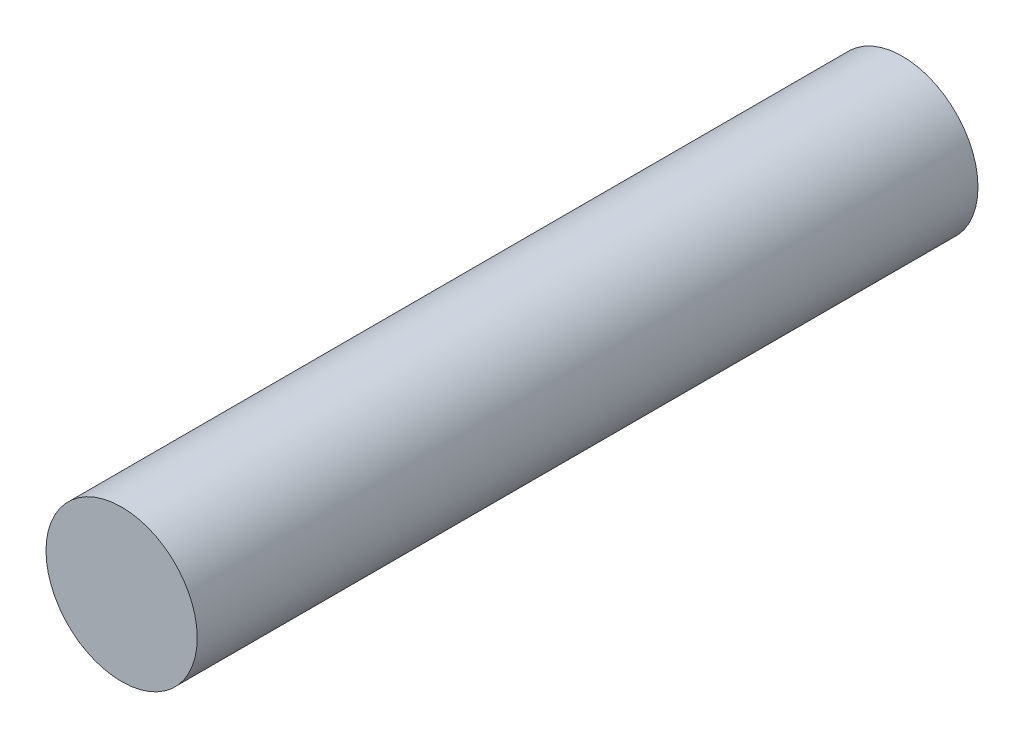
ISO-10303-21;
HEADER;
FILE_DESCRIPTION(('STEP AP214'),'2;1');
FILE_NAME('part.step','',(''),(''),'','','');
FILE_SCHEMA(('AUTOMOTIVE_DESIGN { 1 0 10303 214 1 1 1 1 }'));
ENDSEC;
DATA;
#1=APPLICATION_CONTEXT('core data for automotive mechanical design processes');
#2=APPLICATION_PROTOCOL_DEFINITION('international standard','automotive_design',2000,#1);
#3=PRODUCT_CONTEXT('',#1,'mechanical');
#4=PRODUCT('Part','Part','',(#3));
#5=PRODUCT_RELATED_PRODUCT_CATEGORY('part','',(#4));
#6=PRODUCT_DEFINITION_FORMATION('','',#4);
#7=PRODUCT_DEFINITION_CONTEXT('part definition',#1,'design');
#8=PRODUCT_DEFINITION('design','',#6,#7);
#9=PRODUCT_DEFINITION_SHAPE('','',#8);
#10=(LENGTH_UNIT() NAMED_UNIT(*) SI_UNIT(.MILLI.,.METRE.));
#11=(NAMED_UNIT(*) PLANE_ANGLE_UNIT() SI_UNIT($,.RADIAN.));
#12=(NAMED_UNIT(*) SI_UNIT($,.STERADIAN.) SOLID_ANGLE_UNIT());
#13=UNCERTAINTY_MEASURE_WITH_UNIT(LENGTH_MEASURE(1.E-05),#10,'distance_accuracy_value','');
#14=(GEOMETRIC_REPRESENTATION_CONTEXT(3) GLOBAL_UNCERTAINTY_ASSIGNED_CONTEXT((#13)) GLOBAL_UNIT_ASSIGNED_CONTEXT((#10,
#11,#12)) REPRESENTATION_CONTEXT('',''));
#15=CARTESIAN_POINT('',(0.,0.,0.));
#16=DIRECTION('',(0.,0.,1.));
#17=DIRECTION('',(1.,0.,0.));
#18=AXIS2_PLACEMENT_3D('',#15,#16,#17);
#19=CARTESIAN_POINT('',(0.,0.,11.3577510003558));
#20=DIRECTION('',(0.,0.,1.));
#21=DIRECTION('',(1.,0.,0.));
#22=AXIS2_PLACEMENT_3D('',#19,#20,#21);
#23=PLANE('',#22);
#24=CARTESIAN_POINT('',(0.,0.,11.3577510003558));
#25=DIRECTION('',(0.,0.,-1.));
#26=DIRECTION('',(-1.,0.,0.));
#27=AXIS2_PLACEMENT_3D('',#24,#25,#26);
#28=CIRCLE('',#27,2.2);
#29=CARTESIAN_POINT('',(-2.2,0.,11.3577510003558));
#30=VERTEX_POINT('',#29);
#31=EDGE_CURVE('E9',#30,#30,#28,.T.);
#32=ORIENTED_EDGE('',*,*,#31,.F.);
#33=EDGE_LOOP('',(#32));
#34=FACE_BOUND('',#33,.T.);
#35=ADVANCED_FACE('F14',(#34),#23,.T.);
#36=CARTESIAN_POINT('',(0.,0.,-11.3577510003558));
#37=DIRECTION('',(0.,0.,-1.));
#38=DIRECTION('',(-1.,0.,0.));
#39=AXIS2_PLACEMENT_3D('',#36,#37,#38);
#40=PLANE('',#39);
#41=CARTESIAN_POINT('',(0.,0.,-11.3577510003558));
#42=DIRECTION('',(0.,0.,1.));
#43=DIRECTION('',(1.,0.,0.));
#44=AXIS2_PLACEMENT_3D('',#41,#42,#43);
#45=CIRCLE('',#44,2.2);
#46=CARTESIAN_POINT('',(2.2,0.,-11.3577510003558));
#47=VERTEX_POINT('',#46);
#48=EDGE_CURVE('E21',#47,#47,#45,.T.);
#49=ORIENTED_EDGE('',*,*,#48,.F.);
#50=EDGE_LOOP('',(#49));
#51=FACE_BOUND('',#50,.T.);
#52=ADVANCED_FACE('F29',(#51),#40,.T.);
#53=CARTESIAN_POINT('',(0.,0.,-11.3577510003558));
#54=DIRECTION('',(0.,0.,1.));
#55=DIRECTION('',(1.,0.,0.));
#56=AXIS2_PLACEMENT_3D('',#53,#54,#55);
#57=CYLINDRICAL_SURFACE('',#56,2.2);
#58=ORIENTED_EDGE('',*,*,#31,.T.);
#59=EDGE_LOOP('',(#58));
#60=FACE_BOUND('',#59,.T.);
#61=ORIENTED_EDGE('',*,*,#48,.T.);
#62=EDGE_LOOP('',(#61));
#63=FACE_BOUND('',#62,.T.);
#64=ADVANCED_FACE('F16',(#60,#63),#57,.T.);
#65=CLOSED_SHELL('',(#35,#52,#64));
#66=MANIFOLD_SOLID_BREP('B1',#65);
#67=ADVANCED_BREP_SHAPE_REPRESENTATION('',(#18,#66),#14);
#68=SHAPE_DEFINITION_REPRESENTATION(#9,#67);
ENDSEC;
END-ISO-10303-21;
